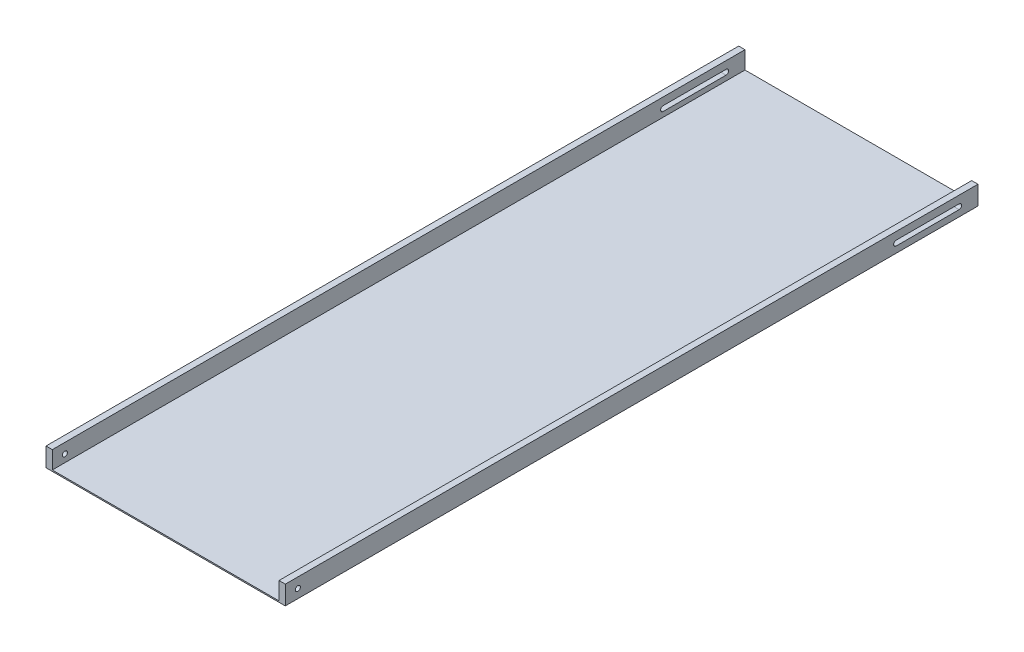
ISO-10303-21;
HEADER;
FILE_DESCRIPTION(('STEP AP214'),'2;1');
FILE_NAME('part.step','',(''),(''),'','','');
FILE_SCHEMA(('AUTOMOTIVE_DESIGN { 1 0 10303 214 1 1 1 1 }'));
ENDSEC;
DATA;
#1=APPLICATION_CONTEXT('core data for automotive mechanical design processes');
#2=APPLICATION_PROTOCOL_DEFINITION('international standard','automotive_design',2000,#1);
#3=PRODUCT_CONTEXT('',#1,'mechanical');
#4=PRODUCT('Part','Part','',(#3));
#5=PRODUCT_RELATED_PRODUCT_CATEGORY('part','',(#4));
#6=PRODUCT_DEFINITION_FORMATION('','',#4);
#7=PRODUCT_DEFINITION_CONTEXT('part definition',#1,'design');
#8=PRODUCT_DEFINITION('design','',#6,#7);
#9=PRODUCT_DEFINITION_SHAPE('','',#8);
#10=(LENGTH_UNIT() NAMED_UNIT(*) SI_UNIT(.MILLI.,.METRE.));
#11=(NAMED_UNIT(*) PLANE_ANGLE_UNIT() SI_UNIT($,.RADIAN.));
#12=(NAMED_UNIT(*) SI_UNIT($,.STERADIAN.) SOLID_ANGLE_UNIT());
#13=UNCERTAINTY_MEASURE_WITH_UNIT(LENGTH_MEASURE(1.E-05),#10,'distance_accuracy_value','');
#14=(GEOMETRIC_REPRESENTATION_CONTEXT(3) GLOBAL_UNCERTAINTY_ASSIGNED_CONTEXT((#13)) GLOBAL_UNIT_ASSIGNED_CONTEXT((#10,
#11,#12)) REPRESENTATION_CONTEXT('',''));
#15=CARTESIAN_POINT('',(0.,0.,0.));
#16=DIRECTION('',(0.,0.,1.));
#17=DIRECTION('',(1.,0.,0.));
#18=AXIS2_PLACEMENT_3D('',#15,#16,#17);
#19=CARTESIAN_POINT('',(-170.647058823529,7.85294117647057,550.));
#20=DIRECTION('',(0.,-1.,0.));
#21=DIRECTION('',(0.,0.,-1.));
#22=AXIS2_PLACEMENT_3D('',#19,#20,#21);
#23=PLANE('',#22);
#24=DIRECTION('',(-1.,0.,0.));
#25=VECTOR('',#24,1.);
#26=CARTESIAN_POINT('',(-170.647058823529,7.85294117647057,0.));
#27=LINE('',#26,#25);
#28=CARTESIAN_POINT('',(-170.647058823529,7.85294117647057,0.));
#29=VERTEX_POINT('',#28);
#30=CARTESIAN_POINT('',(-175.647058823529,7.85294117647057,0.));
#31=VERTEX_POINT('',#30);
#32=EDGE_CURVE('E213',#29,#31,#27,.T.);
#33=ORIENTED_EDGE('',*,*,#32,.T.);
#34=DIRECTION('',(0.,0.,-1.));
#35=VECTOR('',#34,1.);
#36=CARTESIAN_POINT('',(-175.647058823529,7.85294117647057,550.));
#37=LINE('',#36,#35);
#38=CARTESIAN_POINT('',(-175.647058823529,7.85294117647057,550.));
#39=VERTEX_POINT('',#38);
#40=EDGE_CURVE('E268',#39,#31,#37,.T.);
#41=ORIENTED_EDGE('',*,*,#40,.F.);
#42=DIRECTION('',(-1.,0.,0.));
#43=VECTOR('',#42,1.);
#44=CARTESIAN_POINT('',(-170.647058823529,7.85294117647057,550.));
#45=LINE('',#44,#43);
#46=CARTESIAN_POINT('',(-170.647058823529,7.85294117647057,550.));
#47=VERTEX_POINT('',#46);
#48=EDGE_CURVE('E214',#47,#39,#45,.T.);
#49=ORIENTED_EDGE('',*,*,#48,.F.);
#50=DIRECTION('',(0.,0.,-1.));
#51=VECTOR('',#50,1.);
#52=CARTESIAN_POINT('',(-170.647058823529,7.85294117647057,550.));
#53=LINE('',#52,#51);
#54=EDGE_CURVE('E232',#47,#29,#53,.T.);
#55=ORIENTED_EDGE('',*,*,#54,.T.);
#56=EDGE_LOOP('',(#33,#41,#49,#55));
#57=FACE_BOUND('',#56,.T.);
#58=ADVANCED_FACE('F33',(#57),#23,.F.);
#59=CARTESIAN_POINT('',(-175.647058823529,7.85294117647057,550.));
#60=DIRECTION('',(1.,0.,0.));
#61=DIRECTION('',(0.,0.,-1.));
#62=AXIS2_PLACEMENT_3D('',#59,#60,#61);
#63=PLANE('',#62);
#64=DIRECTION('',(0.,0.,1.));
#65=VECTOR('',#64,1.);
#66=CARTESIAN_POINT('',(-175.647058823529,1.85294117647059,65.));
#67=LINE('',#66,#65);
#68=CARTESIAN_POINT('',(-175.647058823529,1.85294117647059,15.));
#69=VERTEX_POINT('',#68);
#70=CARTESIAN_POINT('',(-175.647058823529,1.85294117647059,65.));
#71=VERTEX_POINT('',#70);
#72=EDGE_CURVE('E168',#69,#71,#67,.T.);
#73=ORIENTED_EDGE('',*,*,#72,.T.);
#74=CARTESIAN_POINT('',(-175.647058823529,-0.14705882352941,65.));
#75=DIRECTION('',(1.,0.,0.));
#76=DIRECTION('',(0.,0.,-1.));
#77=AXIS2_PLACEMENT_3D('',#74,#75,#76);
#78=CIRCLE('',#77,2.);
#79=CARTESIAN_POINT('',(-175.647058823529,-2.14705882352941,65.));
#80=VERTEX_POINT('',#79);
#81=EDGE_CURVE('E152',#71,#80,#78,.T.);
#82=ORIENTED_EDGE('',*,*,#81,.T.);
#83=DIRECTION('',(0.,0.,-1.));
#84=VECTOR('',#83,1.);
#85=CARTESIAN_POINT('',(-175.647058823529,-2.14705882352941,15.));
#86=LINE('',#85,#84);
#87=CARTESIAN_POINT('',(-175.647058823529,-2.14705882352941,15.));
#88=VERTEX_POINT('',#87);
#89=EDGE_CURVE('E160',#80,#88,#86,.T.);
#90=ORIENTED_EDGE('',*,*,#89,.T.);
#91=CARTESIAN_POINT('',(-175.647058823529,-0.14705882352941,15.));
#92=DIRECTION('',(1.,0.,0.));
#93=DIRECTION('',(0.,0.,-1.));
#94=AXIS2_PLACEMENT_3D('',#91,#92,#93);
#95=CIRCLE('',#94,2.);
#96=EDGE_CURVE('E47',#88,#69,#95,.T.);
#97=ORIENTED_EDGE('',*,*,#96,.T.);
#98=EDGE_LOOP('',(#73,#82,#90,#97));
#99=FACE_BOUND('',#98,.T.);
#100=CARTESIAN_POINT('',(-175.647058823529,-0.147058823529409,540.));
#101=DIRECTION('',(1.,0.,0.));
#102=DIRECTION('',(0.,0.,-1.));
#103=AXIS2_PLACEMENT_3D('',#100,#101,#102);
#104=CIRCLE('',#103,1.99999999999995);
#105=CARTESIAN_POINT('',(-175.647058823529,-0.147058823529409,538.));
#106=VERTEX_POINT('',#105);
#107=EDGE_CURVE('E206',#106,#106,#104,.T.);
#108=ORIENTED_EDGE('',*,*,#107,.T.);
#109=EDGE_LOOP('',(#108));
#110=FACE_BOUND('',#109,.T.);
#111=DIRECTION('',(0.,-1.,0.));
#112=VECTOR('',#111,1.);
#113=CARTESIAN_POINT('',(-175.647058823529,7.85294117647057,0.));
#114=LINE('',#113,#112);
#115=CARTESIAN_POINT('',(-175.647058823529,-7.14705882352941,0.));
#116=VERTEX_POINT('',#115);
#117=EDGE_CURVE('E235',#31,#116,#114,.T.);
#118=ORIENTED_EDGE('',*,*,#117,.T.);
#119=DIRECTION('',(0.,0.,-1.));
#120=VECTOR('',#119,1.);
#121=CARTESIAN_POINT('',(-175.647058823529,-7.14705882352941,550.));
#122=LINE('',#121,#120);
#123=CARTESIAN_POINT('',(-175.647058823529,-7.14705882352941,550.));
#124=VERTEX_POINT('',#123);
#125=EDGE_CURVE('E265',#124,#116,#122,.T.);
#126=ORIENTED_EDGE('',*,*,#125,.F.);
#127=DIRECTION('',(0.,-1.,0.));
#128=VECTOR('',#127,1.);
#129=CARTESIAN_POINT('',(-175.647058823529,7.85294117647057,550.));
#130=LINE('',#129,#128);
#131=EDGE_CURVE('E217',#39,#124,#130,.T.);
#132=ORIENTED_EDGE('',*,*,#131,.F.);
#133=ORIENTED_EDGE('',*,*,#40,.T.);
#134=EDGE_LOOP('',(#118,#126,#132,#133));
#135=FACE_BOUND('',#134,.T.);
#136=ADVANCED_FACE('F165',(#99,#110,#135),#63,.F.);
#137=CARTESIAN_POINT('',(-175.647058823529,-7.14705882352941,550.));
#138=DIRECTION('',(0.,1.,0.));
#139=DIRECTION('',(0.,0.,1.));
#140=AXIS2_PLACEMENT_3D('',#137,#138,#139);
#141=PLANE('',#140);
#142=DIRECTION('',(1.,0.,0.));
#143=VECTOR('',#142,1.);
#144=CARTESIAN_POINT('',(-175.647058823529,-7.14705882352941,0.));
#145=LINE('',#144,#143);
#146=CARTESIAN_POINT('',(14.3529411764706,-7.14705882352941,0.));
#147=VERTEX_POINT('',#146);
#148=EDGE_CURVE('E237',#116,#147,#145,.T.);
#149=ORIENTED_EDGE('',*,*,#148,.T.);
#150=DIRECTION('',(0.,0.,-1.));
#151=VECTOR('',#150,1.);
#152=CARTESIAN_POINT('',(14.3529411764706,-7.14705882352941,550.));
#153=LINE('',#152,#151);
#154=CARTESIAN_POINT('',(14.3529411764706,-7.14705882352941,550.));
#155=VERTEX_POINT('',#154);
#156=EDGE_CURVE('E262',#155,#147,#153,.T.);
#157=ORIENTED_EDGE('',*,*,#156,.F.);
#158=DIRECTION('',(1.,0.,0.));
#159=VECTOR('',#158,1.);
#160=CARTESIAN_POINT('',(-175.647058823529,-7.14705882352941,550.));
#161=LINE('',#160,#159);
#162=EDGE_CURVE('E220',#124,#155,#161,.T.);
#163=ORIENTED_EDGE('',*,*,#162,.F.);
#164=ORIENTED_EDGE('',*,*,#125,.T.);
#165=EDGE_LOOP('',(#149,#157,#163,#164));
#166=FACE_BOUND('',#165,.T.);
#167=ADVANCED_FACE('F303',(#166),#141,.F.);
#168=CARTESIAN_POINT('',(14.3529411764706,-7.14705882352941,550.));
#169=DIRECTION('',(-1.,0.,0.));
#170=DIRECTION('',(0.,0.,1.));
#171=AXIS2_PLACEMENT_3D('',#168,#169,#170);
#172=PLANE('',#171);
#173=DIRECTION('',(0.,0.,-1.));
#174=VECTOR('',#173,1.);
#175=CARTESIAN_POINT('',(14.3529411764706,-2.14705882352941,15.));
#176=LINE('',#175,#174);
#177=CARTESIAN_POINT('',(14.3529411764706,-2.14705882352942,65.));
#178=VERTEX_POINT('',#177);
#179=CARTESIAN_POINT('',(14.3529411764706,-2.14705882352941,15.));
#180=VERTEX_POINT('',#179);
#181=EDGE_CURVE('E178',#178,#180,#176,.T.);
#182=ORIENTED_EDGE('',*,*,#181,.F.);
#183=CARTESIAN_POINT('',(14.3529411764706,-0.14705882352941,65.));
#184=DIRECTION('',(1.,0.,0.));
#185=DIRECTION('',(0.,0.,-1.));
#186=AXIS2_PLACEMENT_3D('',#183,#184,#185);
#187=CIRCLE('',#186,2.);
#188=CARTESIAN_POINT('',(14.3529411764706,1.85294117647059,65.));
#189=VERTEX_POINT('',#188);
#190=EDGE_CURVE('E55',#189,#178,#187,.T.);
#191=ORIENTED_EDGE('',*,*,#190,.F.);
#192=DIRECTION('',(0.,0.,1.));
#193=VECTOR('',#192,1.);
#194=CARTESIAN_POINT('',(14.3529411764706,1.85294117647059,65.));
#195=LINE('',#194,#193);
#196=CARTESIAN_POINT('',(14.3529411764706,1.85294117647059,15.));
#197=VERTEX_POINT('',#196);
#198=EDGE_CURVE('E169',#197,#189,#195,.T.);
#199=ORIENTED_EDGE('',*,*,#198,.F.);
#200=CARTESIAN_POINT('',(14.3529411764706,-0.14705882352941,15.));
#201=DIRECTION('',(1.,0.,0.));
#202=DIRECTION('',(0.,0.,-1.));
#203=AXIS2_PLACEMENT_3D('',#200,#201,#202);
#204=CIRCLE('',#203,2.);
#205=EDGE_CURVE('E172',#180,#197,#204,.T.);
#206=ORIENTED_EDGE('',*,*,#205,.F.);
#207=EDGE_LOOP('',(#182,#191,#199,#206));
#208=FACE_BOUND('',#207,.T.);
#209=CARTESIAN_POINT('',(14.3529411764706,-0.147058823529409,540.));
#210=DIRECTION('',(1.,0.,0.));
#211=DIRECTION('',(0.,0.,-1.));
#212=AXIS2_PLACEMENT_3D('',#209,#210,#211);
#213=CIRCLE('',#212,1.99999999999998);
#214=CARTESIAN_POINT('',(14.3529411764706,-0.147058823529409,538.));
#215=VERTEX_POINT('',#214);
#216=EDGE_CURVE('E203',#215,#215,#213,.T.);
#217=ORIENTED_EDGE('',*,*,#216,.F.);
#218=EDGE_LOOP('',(#217));
#219=FACE_BOUND('',#218,.T.);
#220=DIRECTION('',(0.,1.,0.));
#221=VECTOR('',#220,1.);
#222=CARTESIAN_POINT('',(14.3529411764706,-7.14705882352941,0.));
#223=LINE('',#222,#221);
#224=CARTESIAN_POINT('',(14.3529411764706,7.85294117647059,0.));
#225=VERTEX_POINT('',#224);
#226=EDGE_CURVE('E239',#147,#225,#223,.T.);
#227=ORIENTED_EDGE('',*,*,#226,.T.);
#228=DIRECTION('',(0.,0.,-1.));
#229=VECTOR('',#228,1.);
#230=CARTESIAN_POINT('',(14.3529411764706,7.85294117647059,550.));
#231=LINE('',#230,#229);
#232=CARTESIAN_POINT('',(14.3529411764706,7.85294117647059,550.));
#233=VERTEX_POINT('',#232);
#234=EDGE_CURVE('E259',#233,#225,#231,.T.);
#235=ORIENTED_EDGE('',*,*,#234,.F.);
#236=DIRECTION('',(0.,1.,0.));
#237=VECTOR('',#236,1.);
#238=CARTESIAN_POINT('',(14.3529411764706,-7.14705882352941,550.));
#239=LINE('',#238,#237);
#240=EDGE_CURVE('E222',#155,#233,#239,.T.);
#241=ORIENTED_EDGE('',*,*,#240,.F.);
#242=ORIENTED_EDGE('',*,*,#156,.T.);
#243=EDGE_LOOP('',(#227,#235,#241,#242));
#244=FACE_BOUND('',#243,.T.);
#245=ADVANCED_FACE('F338',(#208,#219,#244),#172,.F.);
#246=CARTESIAN_POINT('',(14.3529411764706,7.85294117647059,550.));
#247=DIRECTION('',(0.,-1.,0.));
#248=DIRECTION('',(0.,0.,-1.));
#249=AXIS2_PLACEMENT_3D('',#246,#247,#248);
#250=PLANE('',#249);
#251=DIRECTION('',(-1.,0.,0.));
#252=VECTOR('',#251,1.);
#253=CARTESIAN_POINT('',(14.3529411764706,7.85294117647059,0.));
#254=LINE('',#253,#252);
#255=CARTESIAN_POINT('',(9.35294117647058,7.85294117647059,0.));
#256=VERTEX_POINT('',#255);
#257=EDGE_CURVE('E241',#225,#256,#254,.T.);
#258=ORIENTED_EDGE('',*,*,#257,.T.);
#259=DIRECTION('',(0.,0.,-1.));
#260=VECTOR('',#259,1.);
#261=CARTESIAN_POINT('',(9.35294117647058,7.85294117647059,550.));
#262=LINE('',#261,#260);
#263=CARTESIAN_POINT('',(9.35294117647058,7.85294117647059,550.));
#264=VERTEX_POINT('',#263);
#265=EDGE_CURVE('E256',#264,#256,#262,.T.);
#266=ORIENTED_EDGE('',*,*,#265,.F.);
#267=DIRECTION('',(-1.,0.,0.));
#268=VECTOR('',#267,1.);
#269=CARTESIAN_POINT('',(14.3529411764706,7.85294117647059,550.));
#270=LINE('',#269,#268);
#271=EDGE_CURVE('E224',#233,#264,#270,.T.);
#272=ORIENTED_EDGE('',*,*,#271,.F.);
#273=ORIENTED_EDGE('',*,*,#234,.T.);
#274=EDGE_LOOP('',(#258,#266,#272,#273));
#275=FACE_BOUND('',#274,.T.);
#276=ADVANCED_FACE('F334',(#275),#250,.F.);
#277=CARTESIAN_POINT('',(9.35294117647058,7.85294117647059,550.));
#278=DIRECTION('',(1.,0.,0.));
#279=DIRECTION('',(0.,0.,-1.));
#280=AXIS2_PLACEMENT_3D('',#277,#278,#279);
#281=PLANE('',#280);
#282=DIRECTION('',(0.,0.,1.));
#283=VECTOR('',#282,1.);
#284=CARTESIAN_POINT('',(9.35294117647058,1.85294117647059,550.));
#285=LINE('',#284,#283);
#286=CARTESIAN_POINT('',(9.35294117647056,1.85294117647059,15.));
#287=VERTEX_POINT('',#286);
#288=CARTESIAN_POINT('',(9.35294117647056,1.85294117647059,65.));
#289=VERTEX_POINT('',#288);
#290=EDGE_CURVE('E197',#287,#289,#285,.T.);
#291=ORIENTED_EDGE('',*,*,#290,.T.);
#292=CARTESIAN_POINT('',(9.35294117647056,-0.14705882352941,65.));
#293=DIRECTION('',(1.,0.,0.));
#294=DIRECTION('',(0.,0.,-1.));
#295=AXIS2_PLACEMENT_3D('',#292,#293,#294);
#296=CIRCLE('',#295,2.);
#297=CARTESIAN_POINT('',(9.35294117647056,-2.14705882352941,65.));
#298=VERTEX_POINT('',#297);
#299=EDGE_CURVE('E200',#289,#298,#296,.T.);
#300=ORIENTED_EDGE('',*,*,#299,.T.);
#301=DIRECTION('',(0.,0.,-1.));
#302=VECTOR('',#301,1.);
#303=CARTESIAN_POINT('',(9.35294117647058,-2.14705882352947,550.));
#304=LINE('',#303,#302);
#305=CARTESIAN_POINT('',(9.35294117647058,-2.14705882352941,15.));
#306=VERTEX_POINT('',#305);
#307=EDGE_CURVE('E185',#298,#306,#304,.T.);
#308=ORIENTED_EDGE('',*,*,#307,.T.);
#309=CARTESIAN_POINT('',(9.35294117647056,-0.14705882352941,15.));
#310=DIRECTION('',(1.,0.,0.));
#311=DIRECTION('',(0.,0.,-1.));
#312=AXIS2_PLACEMENT_3D('',#309,#310,#311);
#313=CIRCLE('',#312,2.);
#314=EDGE_CURVE('E194',#306,#287,#313,.T.);
#315=ORIENTED_EDGE('',*,*,#314,.T.);
#316=EDGE_LOOP('',(#291,#300,#308,#315));
#317=FACE_BOUND('',#316,.T.);
#318=CARTESIAN_POINT('',(9.35294117647058,-0.147058823529409,540.));
#319=DIRECTION('',(1.,0.,0.));
#320=DIRECTION('',(0.,0.,-1.));
#321=AXIS2_PLACEMENT_3D('',#318,#319,#320);
#322=CIRCLE('',#321,1.99999999999997);
#323=CARTESIAN_POINT('',(9.35294117647058,-0.147058823529409,538.));
#324=VERTEX_POINT('',#323);
#325=EDGE_CURVE('E209',#324,#324,#322,.T.);
#326=ORIENTED_EDGE('',*,*,#325,.T.);
#327=EDGE_LOOP('',(#326));
#328=FACE_BOUND('',#327,.T.);
#329=DIRECTION('',(0.,-1.,0.));
#330=VECTOR('',#329,1.);
#331=CARTESIAN_POINT('',(9.35294117647058,7.85294117647059,0.));
#332=LINE('',#331,#330);
#333=CARTESIAN_POINT('',(9.35294117647058,-6.14705882352941,0.));
#334=VERTEX_POINT('',#333);
#335=EDGE_CURVE('E243',#256,#334,#332,.T.);
#336=ORIENTED_EDGE('',*,*,#335,.T.);
#337=DIRECTION('',(0.,0.,-1.));
#338=VECTOR('',#337,1.);
#339=CARTESIAN_POINT('',(9.35294117647058,-6.14705882352941,550.));
#340=LINE('',#339,#338);
#341=CARTESIAN_POINT('',(9.35294117647058,-6.14705882352941,550.));
#342=VERTEX_POINT('',#341);
#343=EDGE_CURVE('E253',#342,#334,#340,.T.);
#344=ORIENTED_EDGE('',*,*,#343,.F.);
#345=DIRECTION('',(0.,-1.,0.));
#346=VECTOR('',#345,1.);
#347=CARTESIAN_POINT('',(9.35294117647058,7.85294117647059,550.));
#348=LINE('',#347,#346);
#349=EDGE_CURVE('E226',#264,#342,#348,.T.);
#350=ORIENTED_EDGE('',*,*,#349,.F.);
#351=ORIENTED_EDGE('',*,*,#265,.T.);
#352=EDGE_LOOP('',(#336,#344,#350,#351));
#353=FACE_BOUND('',#352,.T.);
#354=ADVANCED_FACE('F329',(#317,#328,#353),#281,.F.);
#355=CARTESIAN_POINT('',(9.35294117647058,-6.14705882352941,550.));
#356=DIRECTION('',(0.,-1.,0.));
#357=DIRECTION('',(1.,0.,0.));
#358=AXIS2_PLACEMENT_3D('',#355,#356,#357);
#359=PLANE('',#358);
#360=DIRECTION('',(-1.,0.,0.));
#361=VECTOR('',#360,1.);
#362=CARTESIAN_POINT('',(9.35294117647058,-6.14705882352941,0.));
#363=LINE('',#362,#361);
#364=CARTESIAN_POINT('',(-170.647058823529,-6.14705882352943,0.));
#365=VERTEX_POINT('',#364);
#366=EDGE_CURVE('E245',#334,#365,#363,.T.);
#367=ORIENTED_EDGE('',*,*,#366,.T.);
#368=DIRECTION('',(0.,0.,-1.));
#369=VECTOR('',#368,1.);
#370=CARTESIAN_POINT('',(-170.647058823529,-6.14705882352943,550.));
#371=LINE('',#370,#369);
#372=CARTESIAN_POINT('',(-170.647058823529,-6.14705882352943,550.));
#373=VERTEX_POINT('',#372);
#374=EDGE_CURVE('E250',#373,#365,#371,.T.);
#375=ORIENTED_EDGE('',*,*,#374,.F.);
#376=DIRECTION('',(-1.,0.,0.));
#377=VECTOR('',#376,1.);
#378=CARTESIAN_POINT('',(9.35294117647058,-6.14705882352941,550.));
#379=LINE('',#378,#377);
#380=EDGE_CURVE('E228',#342,#373,#379,.T.);
#381=ORIENTED_EDGE('',*,*,#380,.F.);
#382=ORIENTED_EDGE('',*,*,#343,.T.);
#383=EDGE_LOOP('',(#367,#375,#381,#382));
#384=FACE_BOUND('',#383,.T.);
#385=ADVANCED_FACE('F324',(#384),#359,.F.);
#386=CARTESIAN_POINT('',(-170.647058823529,-6.14705882352943,550.));
#387=DIRECTION('',(-1.,0.,0.));
#388=DIRECTION('',(0.,0.,1.));
#389=AXIS2_PLACEMENT_3D('',#386,#387,#388);
#390=PLANE('',#389);
#391=DIRECTION('',(0.,0.,1.));
#392=VECTOR('',#391,1.);
#393=CARTESIAN_POINT('',(-170.647058823529,-2.14705882352947,550.));
#394=LINE('',#393,#392);
#395=CARTESIAN_POINT('',(-170.647058823529,-2.14705882352941,15.));
#396=VERTEX_POINT('',#395);
#397=CARTESIAN_POINT('',(-170.647058823529,-2.14705882352942,65.));
#398=VERTEX_POINT('',#397);
#399=EDGE_CURVE('E271',#396,#398,#394,.T.);
#400=ORIENTED_EDGE('',*,*,#399,.T.);
#401=CARTESIAN_POINT('',(-170.647058823529,-0.14705882352941,65.));
#402=DIRECTION('',(-1.,0.,0.));
#403=DIRECTION('',(0.,0.,1.));
#404=AXIS2_PLACEMENT_3D('',#401,#402,#403);
#405=CIRCLE('',#404,2.);
#406=CARTESIAN_POINT('',(-170.647058823529,1.85294117647059,65.));
#407=VERTEX_POINT('',#406);
#408=EDGE_CURVE('E11',#398,#407,#405,.T.);
#409=ORIENTED_EDGE('',*,*,#408,.T.);
#410=DIRECTION('',(0.,0.,-1.));
#411=VECTOR('',#410,1.);
#412=CARTESIAN_POINT('',(-170.647058823529,1.85294117647059,550.));
#413=LINE('',#412,#411);
#414=CARTESIAN_POINT('',(-170.647058823529,1.85294117647059,15.));
#415=VERTEX_POINT('',#414);
#416=EDGE_CURVE('E40',#407,#415,#413,.T.);
#417=ORIENTED_EDGE('',*,*,#416,.T.);
#418=CARTESIAN_POINT('',(-170.647058823529,-0.14705882352941,15.));
#419=DIRECTION('',(-1.,0.,0.));
#420=DIRECTION('',(0.,0.,1.));
#421=AXIS2_PLACEMENT_3D('',#418,#419,#420);
#422=CIRCLE('',#421,2.);
#423=EDGE_CURVE('E275',#415,#396,#422,.T.);
#424=ORIENTED_EDGE('',*,*,#423,.T.);
#425=EDGE_LOOP('',(#400,#409,#417,#424));
#426=FACE_BOUND('',#425,.T.);
#427=CARTESIAN_POINT('',(-170.647058823529,-0.147058823529409,540.));
#428=DIRECTION('',(-1.,0.,0.));
#429=DIRECTION('',(0.,0.,1.));
#430=AXIS2_PLACEMENT_3D('',#427,#428,#429);
#431=CIRCLE('',#430,1.99999999999997);
#432=CARTESIAN_POINT('',(-170.647058823529,-0.147058823529409,542.));
#433=VERTEX_POINT('',#432);
#434=EDGE_CURVE('E210',#433,#433,#431,.T.);
#435=ORIENTED_EDGE('',*,*,#434,.T.);
#436=EDGE_LOOP('',(#435));
#437=FACE_BOUND('',#436,.T.);
#438=DIRECTION('',(0.,1.,0.));
#439=VECTOR('',#438,1.);
#440=CARTESIAN_POINT('',(-170.647058823529,-6.14705882352943,0.));
#441=LINE('',#440,#439);
#442=EDGE_CURVE('E218',#365,#29,#441,.T.);
#443=ORIENTED_EDGE('',*,*,#442,.T.);
#444=ORIENTED_EDGE('',*,*,#54,.F.);
#445=DIRECTION('',(0.,1.,0.));
#446=VECTOR('',#445,1.);
#447=CARTESIAN_POINT('',(-170.647058823529,-6.14705882352943,550.));
#448=LINE('',#447,#446);
#449=EDGE_CURVE('E230',#373,#47,#448,.T.);
#450=ORIENTED_EDGE('',*,*,#449,.F.);
#451=ORIENTED_EDGE('',*,*,#374,.T.);
#452=EDGE_LOOP('',(#443,#444,#450,#451));
#453=FACE_BOUND('',#452,.T.);
#454=ADVANCED_FACE('F279',(#426,#437,#453),#390,.F.);
#455=CARTESIAN_POINT('',(0.,0.,550.));
#456=DIRECTION('',(0.,0.,1.));
#457=DIRECTION('',(1.,0.,0.));
#458=AXIS2_PLACEMENT_3D('',#455,#456,#457);
#459=PLANE('',#458);
#460=ORIENTED_EDGE('',*,*,#48,.T.);
#461=ORIENTED_EDGE('',*,*,#131,.T.);
#462=ORIENTED_EDGE('',*,*,#162,.T.);
#463=ORIENTED_EDGE('',*,*,#240,.T.);
#464=ORIENTED_EDGE('',*,*,#271,.T.);
#465=ORIENTED_EDGE('',*,*,#349,.T.);
#466=ORIENTED_EDGE('',*,*,#380,.T.);
#467=ORIENTED_EDGE('',*,*,#449,.T.);
#468=EDGE_LOOP('',(#460,#461,#462,#463,#464,#465,#466,#467));
#469=FACE_BOUND('',#468,.T.);
#470=ADVANCED_FACE('F318',(#469),#459,.T.);
#471=CARTESIAN_POINT('',(0.,0.,0.));
#472=DIRECTION('',(0.,0.,1.));
#473=DIRECTION('',(1.,0.,0.));
#474=AXIS2_PLACEMENT_3D('',#471,#472,#473);
#475=PLANE('',#474);
#476=ORIENTED_EDGE('',*,*,#32,.F.);
#477=ORIENTED_EDGE('',*,*,#442,.F.);
#478=ORIENTED_EDGE('',*,*,#366,.F.);
#479=ORIENTED_EDGE('',*,*,#335,.F.);
#480=ORIENTED_EDGE('',*,*,#257,.F.);
#481=ORIENTED_EDGE('',*,*,#226,.F.);
#482=ORIENTED_EDGE('',*,*,#148,.F.);
#483=ORIENTED_EDGE('',*,*,#117,.F.);
#484=EDGE_LOOP('',(#476,#477,#478,#479,#480,#481,#482,#483));
#485=FACE_BOUND('',#484,.T.);
#486=ADVANCED_FACE('F310',(#485),#475,.F.);
#487=CARTESIAN_POINT('',(14.3529411764706,-0.147058823529409,540.));
#488=DIRECTION('',(1.,0.,0.));
#489=DIRECTION('',(0.,0.,-1.));
#490=AXIS2_PLACEMENT_3D('',#487,#488,#489);
#491=CYLINDRICAL_SURFACE('',#490,1.99999999999997);
#492=ORIENTED_EDGE('',*,*,#216,.T.);
#493=EDGE_LOOP('',(#492));
#494=FACE_BOUND('',#493,.T.);
#495=ORIENTED_EDGE('',*,*,#325,.F.);
#496=EDGE_LOOP('',(#495));
#497=FACE_BOUND('',#496,.T.);
#498=ADVANCED_FACE('F360',(#494,#497),#491,.F.);
#499=ORIENTED_EDGE('',*,*,#107,.F.);
#500=EDGE_LOOP('',(#499));
#501=FACE_BOUND('',#500,.T.);
#502=ORIENTED_EDGE('',*,*,#434,.F.);
#503=EDGE_LOOP('',(#502));
#504=FACE_BOUND('',#503,.T.);
#505=ADVANCED_FACE('F293',(#501,#504),#491,.F.);
#506=CARTESIAN_POINT('',(-175.647058823529,-2.14705882352941,15.));
#507=DIRECTION('',(0.,-1.,0.));
#508=DIRECTION('',(0.,0.,-1.));
#509=AXIS2_PLACEMENT_3D('',#506,#507,#508);
#510=PLANE('',#509);
#511=DIRECTION('',(1.,0.,0.));
#512=VECTOR('',#511,1.);
#513=CARTESIAN_POINT('',(-175.647058823529,-2.14705882352941,15.));
#514=LINE('',#513,#512);
#515=EDGE_CURVE('E162',#88,#396,#514,.T.);
#516=ORIENTED_EDGE('',*,*,#515,.F.);
#517=ORIENTED_EDGE('',*,*,#89,.F.);
#518=DIRECTION('',(1.,0.,0.));
#519=VECTOR('',#518,1.);
#520=CARTESIAN_POINT('',(-175.647058823529,-2.14705882352941,65.));
#521=LINE('',#520,#519);
#522=EDGE_CURVE('E147',#80,#398,#521,.T.);
#523=ORIENTED_EDGE('',*,*,#522,.T.);
#524=ORIENTED_EDGE('',*,*,#399,.F.);
#525=EDGE_LOOP('',(#516,#517,#523,#524));
#526=FACE_BOUND('',#525,.T.);
#527=ADVANCED_FACE('F161',(#526),#510,.F.);
#528=CARTESIAN_POINT('',(-175.647058823529,-0.14705882352941,15.));
#529=DIRECTION('',(1.,0.,0.));
#530=DIRECTION('',(0.,0.,-1.));
#531=AXIS2_PLACEMENT_3D('',#528,#529,#530);
#532=CYLINDRICAL_SURFACE('',#531,2.);
#533=DIRECTION('',(1.,0.,0.));
#534=VECTOR('',#533,1.);
#535=CARTESIAN_POINT('',(-175.647058823529,1.85294117647059,15.));
#536=LINE('',#535,#534);
#537=EDGE_CURVE('E187',#69,#415,#536,.T.);
#538=ORIENTED_EDGE('',*,*,#537,.F.);
#539=ORIENTED_EDGE('',*,*,#96,.F.);
#540=ORIENTED_EDGE('',*,*,#515,.T.);
#541=ORIENTED_EDGE('',*,*,#423,.F.);
#542=EDGE_LOOP('',(#538,#539,#540,#541));
#543=FACE_BOUND('',#542,.T.);
#544=ADVANCED_FACE('F283',(#543),#532,.F.);
#545=CARTESIAN_POINT('',(-175.647058823529,1.85294117647059,65.));
#546=DIRECTION('',(0.,1.,0.));
#547=DIRECTION('',(0.,0.,1.));
#548=AXIS2_PLACEMENT_3D('',#545,#546,#547);
#549=PLANE('',#548);
#550=DIRECTION('',(1.,0.,0.));
#551=VECTOR('',#550,1.);
#552=CARTESIAN_POINT('',(-175.647058823529,1.85294117647059,65.));
#553=LINE('',#552,#551);
#554=EDGE_CURVE('E183',#71,#407,#553,.T.);
#555=ORIENTED_EDGE('',*,*,#554,.F.);
#556=ORIENTED_EDGE('',*,*,#72,.F.);
#557=ORIENTED_EDGE('',*,*,#537,.T.);
#558=ORIENTED_EDGE('',*,*,#416,.F.);
#559=EDGE_LOOP('',(#555,#556,#557,#558));
#560=FACE_BOUND('',#559,.T.);
#561=ADVANCED_FACE('F282',(#560),#549,.F.);
#562=CARTESIAN_POINT('',(-175.647058823529,-0.14705882352941,65.));
#563=DIRECTION('',(1.,0.,0.));
#564=DIRECTION('',(0.,0.,-1.));
#565=AXIS2_PLACEMENT_3D('',#562,#563,#564);
#566=CYLINDRICAL_SURFACE('',#565,2.);
#567=ORIENTED_EDGE('',*,*,#522,.F.);
#568=ORIENTED_EDGE('',*,*,#81,.F.);
#569=ORIENTED_EDGE('',*,*,#554,.T.);
#570=ORIENTED_EDGE('',*,*,#408,.F.);
#571=EDGE_LOOP('',(#567,#568,#569,#570));
#572=FACE_BOUND('',#571,.T.);
#573=ADVANCED_FACE('F149',(#572),#566,.F.);
#574=EDGE_CURVE('E186',#289,#189,#553,.T.);
#575=ORIENTED_EDGE('',*,*,#574,.T.);
#576=ORIENTED_EDGE('',*,*,#190,.T.);
#577=EDGE_CURVE('E157',#298,#178,#521,.T.);
#578=ORIENTED_EDGE('',*,*,#577,.F.);
#579=ORIENTED_EDGE('',*,*,#299,.F.);
#580=EDGE_LOOP('',(#575,#576,#578,#579));
#581=FACE_BOUND('',#580,.T.);
#582=ADVANCED_FACE('F366',(#581),#566,.F.);
#583=EDGE_CURVE('E190',#287,#197,#536,.T.);
#584=ORIENTED_EDGE('',*,*,#583,.T.);
#585=ORIENTED_EDGE('',*,*,#198,.T.);
#586=ORIENTED_EDGE('',*,*,#574,.F.);
#587=ORIENTED_EDGE('',*,*,#290,.F.);
#588=EDGE_LOOP('',(#584,#585,#586,#587));
#589=FACE_BOUND('',#588,.T.);
#590=ADVANCED_FACE('F292',(#589),#549,.F.);
#591=EDGE_CURVE('E156',#306,#180,#514,.T.);
#592=ORIENTED_EDGE('',*,*,#591,.T.);
#593=ORIENTED_EDGE('',*,*,#205,.T.);
#594=ORIENTED_EDGE('',*,*,#583,.F.);
#595=ORIENTED_EDGE('',*,*,#314,.F.);
#596=EDGE_LOOP('',(#592,#593,#594,#595));
#597=FACE_BOUND('',#596,.T.);
#598=ADVANCED_FACE('F286',(#597),#532,.F.);
#599=ORIENTED_EDGE('',*,*,#577,.T.);
#600=ORIENTED_EDGE('',*,*,#181,.T.);
#601=ORIENTED_EDGE('',*,*,#591,.F.);
#602=ORIENTED_EDGE('',*,*,#307,.F.);
#603=EDGE_LOOP('',(#599,#600,#601,#602));
#604=FACE_BOUND('',#603,.T.);
#605=ADVANCED_FACE('F295',(#604),#510,.F.);
#606=CLOSED_SHELL('',(#58,#136,#167,#245,#276,#354,#385,#454,#470,#486,#498,#505,#527,#544,#561,
#573,#582,#590,#598,#605));
#607=MANIFOLD_SOLID_BREP('B2',#606);
#608=ADVANCED_BREP_SHAPE_REPRESENTATION('',(#18,#607),#14);
#609=SHAPE_DEFINITION_REPRESENTATION(#9,#608);
ENDSEC;
END-ISO-10303-21;
